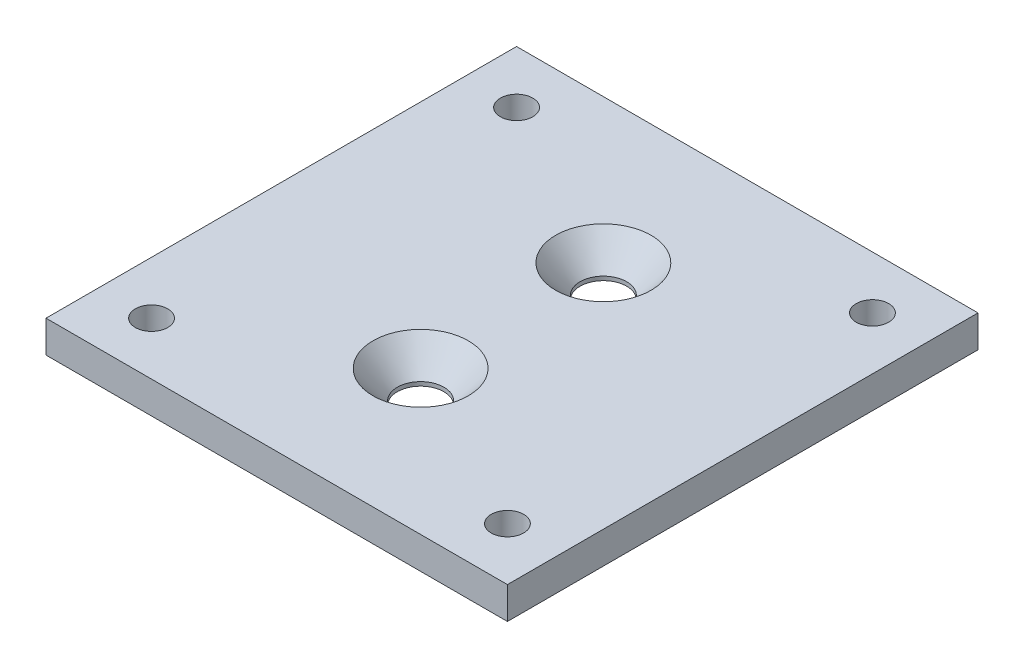
ISO-10303-21;
HEADER;
FILE_DESCRIPTION(('STEP AP214'),'2;1');
FILE_NAME('part.step','',(''),(''),'','','');
FILE_SCHEMA(('AUTOMOTIVE_DESIGN { 1 0 10303 214 1 1 1 1 }'));
ENDSEC;
DATA;
#1=APPLICATION_CONTEXT('core data for automotive mechanical design processes');
#2=APPLICATION_PROTOCOL_DEFINITION('international standard','automotive_design',2000,#1);
#3=PRODUCT_CONTEXT('',#1,'mechanical');
#4=PRODUCT('Part','Part','',(#3));
#5=PRODUCT_RELATED_PRODUCT_CATEGORY('part','',(#4));
#6=PRODUCT_DEFINITION_FORMATION('','',#4);
#7=PRODUCT_DEFINITION_CONTEXT('part definition',#1,'design');
#8=PRODUCT_DEFINITION('design','',#6,#7);
#9=PRODUCT_DEFINITION_SHAPE('','',#8);
#10=(LENGTH_UNIT() NAMED_UNIT(*) SI_UNIT(.MILLI.,.METRE.));
#11=(NAMED_UNIT(*) PLANE_ANGLE_UNIT() SI_UNIT($,.RADIAN.));
#12=(NAMED_UNIT(*) SI_UNIT($,.STERADIAN.) SOLID_ANGLE_UNIT());
#13=UNCERTAINTY_MEASURE_WITH_UNIT(LENGTH_MEASURE(1.E-05),#10,'distance_accuracy_value','');
#14=(GEOMETRIC_REPRESENTATION_CONTEXT(3) GLOBAL_UNCERTAINTY_ASSIGNED_CONTEXT((#13)) GLOBAL_UNIT_ASSIGNED_CONTEXT((#10,
#11,#12)) REPRESENTATION_CONTEXT('',''));
#15=CARTESIAN_POINT('',(0.,0.,0.));
#16=DIRECTION('',(0.,0.,1.));
#17=DIRECTION('',(1.,0.,0.));
#18=AXIS2_PLACEMENT_3D('',#15,#16,#17);
#19=CARTESIAN_POINT('',(0.,3.5,25.75));
#20=DIRECTION('',(0.,0.,-1.));
#21=DIRECTION('',(-1.,0.,0.));
#22=AXIS2_PLACEMENT_3D('',#19,#20,#21);
#23=PLANE('',#22);
#24=DIRECTION('',(1.,0.,0.));
#25=VECTOR('',#24,1.);
#26=CARTESIAN_POINT('',(0.,0.,25.75));
#27=LINE('',#26,#25);
#28=CARTESIAN_POINT('',(-25.25,0.,25.75));
#29=VERTEX_POINT('',#28);
#30=CARTESIAN_POINT('',(25.25,0.,25.75));
#31=VERTEX_POINT('',#30);
#32=EDGE_CURVE('E112',#29,#31,#27,.T.);
#33=ORIENTED_EDGE('',*,*,#32,.T.);
#34=DIRECTION('',(0.,-1.,0.));
#35=VECTOR('',#34,1.);
#36=CARTESIAN_POINT('',(25.25,3.5,25.75));
#37=LINE('',#36,#35);
#38=CARTESIAN_POINT('',(25.25,3.5,25.75));
#39=VERTEX_POINT('',#38);
#40=EDGE_CURVE('E11',#39,#31,#37,.T.);
#41=ORIENTED_EDGE('',*,*,#40,.F.);
#42=DIRECTION('',(1.,0.,0.));
#43=VECTOR('',#42,1.);
#44=CARTESIAN_POINT('',(0.,3.5,25.75));
#45=LINE('',#44,#43);
#46=CARTESIAN_POINT('',(-25.25,3.5,25.75));
#47=VERTEX_POINT('',#46);
#48=EDGE_CURVE('E85',#47,#39,#45,.T.);
#49=ORIENTED_EDGE('',*,*,#48,.F.);
#50=DIRECTION('',(0.,-1.,0.));
#51=VECTOR('',#50,1.);
#52=CARTESIAN_POINT('',(-25.25,3.5,25.75));
#53=LINE('',#52,#51);
#54=EDGE_CURVE('E52',#47,#29,#53,.T.);
#55=ORIENTED_EDGE('',*,*,#54,.T.);
#56=EDGE_LOOP('',(#33,#41,#49,#55));
#57=FACE_BOUND('',#56,.T.);
#58=ADVANCED_FACE('F35',(#57),#23,.F.);
#59=CARTESIAN_POINT('',(25.25,3.5,0.));
#60=DIRECTION('',(-1.,0.,0.));
#61=DIRECTION('',(0.,0.,1.));
#62=AXIS2_PLACEMENT_3D('',#59,#60,#61);
#63=PLANE('',#62);
#64=DIRECTION('',(0.,0.,-1.));
#65=VECTOR('',#64,1.);
#66=CARTESIAN_POINT('',(25.25,0.,0.));
#67=LINE('',#66,#65);
#68=CARTESIAN_POINT('',(25.25,0.,-25.75));
#69=VERTEX_POINT('',#68);
#70=EDGE_CURVE('E90',#31,#69,#67,.T.);
#71=ORIENTED_EDGE('',*,*,#70,.T.);
#72=DIRECTION('',(0.,-1.,0.));
#73=VECTOR('',#72,1.);
#74=CARTESIAN_POINT('',(25.25,3.5,-25.75));
#75=LINE('',#74,#73);
#76=CARTESIAN_POINT('',(25.25,3.5,-25.75));
#77=VERTEX_POINT('',#76);
#78=EDGE_CURVE('E44',#77,#69,#75,.T.);
#79=ORIENTED_EDGE('',*,*,#78,.F.);
#80=DIRECTION('',(0.,0.,-1.));
#81=VECTOR('',#80,1.);
#82=CARTESIAN_POINT('',(25.25,3.5,0.));
#83=LINE('',#82,#81);
#84=EDGE_CURVE('E77',#39,#77,#83,.T.);
#85=ORIENTED_EDGE('',*,*,#84,.F.);
#86=ORIENTED_EDGE('',*,*,#40,.T.);
#87=EDGE_LOOP('',(#71,#79,#85,#86));
#88=FACE_BOUND('',#87,.T.);
#89=ADVANCED_FACE('F89',(#88),#63,.F.);
#90=CARTESIAN_POINT('',(0.,3.5,-25.75));
#91=DIRECTION('',(0.,0.,-1.));
#92=DIRECTION('',(-1.,0.,0.));
#93=AXIS2_PLACEMENT_3D('',#90,#91,#92);
#94=PLANE('',#93);
#95=DIRECTION('',(1.,0.,0.));
#96=VECTOR('',#95,1.);
#97=CARTESIAN_POINT('',(0.,0.,-25.75));
#98=LINE('',#97,#96);
#99=CARTESIAN_POINT('',(-25.25,0.,-25.75));
#100=VERTEX_POINT('',#99);
#101=EDGE_CURVE('E115',#100,#69,#98,.T.);
#102=ORIENTED_EDGE('',*,*,#101,.F.);
#103=DIRECTION('',(0.,-1.,0.));
#104=VECTOR('',#103,1.);
#105=CARTESIAN_POINT('',(-25.25,3.5,-25.75));
#106=LINE('',#105,#104);
#107=CARTESIAN_POINT('',(-25.25,3.5,-25.75));
#108=VERTEX_POINT('',#107);
#109=EDGE_CURVE('E66',#108,#100,#106,.T.);
#110=ORIENTED_EDGE('',*,*,#109,.F.);
#111=DIRECTION('',(1.,0.,0.));
#112=VECTOR('',#111,1.);
#113=CARTESIAN_POINT('',(0.,3.5,-25.75));
#114=LINE('',#113,#112);
#115=EDGE_CURVE('E84',#108,#77,#114,.T.);
#116=ORIENTED_EDGE('',*,*,#115,.T.);
#117=ORIENTED_EDGE('',*,*,#78,.T.);
#118=EDGE_LOOP('',(#102,#110,#116,#117));
#119=FACE_BOUND('',#118,.T.);
#120=ADVANCED_FACE('F93',(#119),#94,.T.);
#121=CARTESIAN_POINT('',(19.475,3.5,19.975));
#122=DIRECTION('',(0.,-1.,0.));
#123=DIRECTION('',(0.,0.,-1.));
#124=AXIS2_PLACEMENT_3D('',#121,#122,#123);
#125=CYLINDRICAL_SURFACE('',#124,1.775);
#126=CARTESIAN_POINT('',(19.475,3.5,19.975));
#127=DIRECTION('',(0.,1.,0.));
#128=DIRECTION('',(0.,0.,1.));
#129=AXIS2_PLACEMENT_3D('',#126,#127,#128);
#130=CIRCLE('',#129,1.775);
#131=CARTESIAN_POINT('',(19.475,3.5,21.75));
#132=VERTEX_POINT('',#131);
#133=EDGE_CURVE('E136',#132,#132,#130,.T.);
#134=ORIENTED_EDGE('',*,*,#133,.T.);
#135=EDGE_LOOP('',(#134));
#136=FACE_BOUND('',#135,.T.);
#137=CARTESIAN_POINT('',(19.475,0.,19.975));
#138=DIRECTION('',(0.,1.,0.));
#139=DIRECTION('',(0.,0.,1.));
#140=AXIS2_PLACEMENT_3D('',#137,#138,#139);
#141=CIRCLE('',#140,1.775);
#142=CARTESIAN_POINT('',(19.475,0.,21.75));
#143=VERTEX_POINT('',#142);
#144=EDGE_CURVE('E109',#143,#143,#141,.T.);
#145=ORIENTED_EDGE('',*,*,#144,.F.);
#146=EDGE_LOOP('',(#145));
#147=FACE_BOUND('',#146,.T.);
#148=ADVANCED_FACE('F140',(#136,#147),#125,.F.);
#149=CARTESIAN_POINT('',(-19.475,3.5,19.975));
#150=DIRECTION('',(0.,-1.,0.));
#151=DIRECTION('',(0.,0.,-1.));
#152=AXIS2_PLACEMENT_3D('',#149,#150,#151);
#153=CYLINDRICAL_SURFACE('',#152,1.775);
#154=CARTESIAN_POINT('',(-19.475,3.5,19.975));
#155=DIRECTION('',(0.,1.,0.));
#156=DIRECTION('',(0.,0.,1.));
#157=AXIS2_PLACEMENT_3D('',#154,#155,#156);
#158=CIRCLE('',#157,1.775);
#159=CARTESIAN_POINT('',(-19.475,3.5,21.75));
#160=VERTEX_POINT('',#159);
#161=EDGE_CURVE('E129',#160,#160,#158,.T.);
#162=ORIENTED_EDGE('',*,*,#161,.T.);
#163=EDGE_LOOP('',(#162));
#164=FACE_BOUND('',#163,.T.);
#165=CARTESIAN_POINT('',(-19.475,0.,19.975));
#166=DIRECTION('',(0.,1.,0.));
#167=DIRECTION('',(0.,0.,1.));
#168=AXIS2_PLACEMENT_3D('',#165,#166,#167);
#169=CIRCLE('',#168,1.775);
#170=CARTESIAN_POINT('',(-19.475,0.,21.75));
#171=VERTEX_POINT('',#170);
#172=EDGE_CURVE('E106',#171,#171,#169,.T.);
#173=ORIENTED_EDGE('',*,*,#172,.F.);
#174=EDGE_LOOP('',(#173));
#175=FACE_BOUND('',#174,.T.);
#176=ADVANCED_FACE('F169',(#164,#175),#153,.F.);
#177=CARTESIAN_POINT('',(19.475,3.5,-19.975));
#178=DIRECTION('',(0.,-1.,0.));
#179=DIRECTION('',(0.,0.,-1.));
#180=AXIS2_PLACEMENT_3D('',#177,#178,#179);
#181=CYLINDRICAL_SURFACE('',#180,1.775);
#182=CARTESIAN_POINT('',(19.475,3.5,-19.975));
#183=DIRECTION('',(0.,1.,0.));
#184=DIRECTION('',(0.,0.,1.));
#185=AXIS2_PLACEMENT_3D('',#182,#183,#184);
#186=CIRCLE('',#185,1.775);
#187=CARTESIAN_POINT('',(19.475,3.5,-18.2));
#188=VERTEX_POINT('',#187);
#189=EDGE_CURVE('E124',#188,#188,#186,.T.);
#190=ORIENTED_EDGE('',*,*,#189,.T.);
#191=EDGE_LOOP('',(#190));
#192=FACE_BOUND('',#191,.T.);
#193=CARTESIAN_POINT('',(19.475,0.,-19.975));
#194=DIRECTION('',(0.,1.,0.));
#195=DIRECTION('',(0.,0.,1.));
#196=AXIS2_PLACEMENT_3D('',#193,#194,#195);
#197=CIRCLE('',#196,1.775);
#198=CARTESIAN_POINT('',(19.475,0.,-18.2));
#199=VERTEX_POINT('',#198);
#200=EDGE_CURVE('E102',#199,#199,#197,.T.);
#201=ORIENTED_EDGE('',*,*,#200,.F.);
#202=EDGE_LOOP('',(#201));
#203=FACE_BOUND('',#202,.T.);
#204=ADVANCED_FACE('F171',(#192,#203),#181,.F.);
#205=CARTESIAN_POINT('',(-19.475,3.5,-19.975));
#206=DIRECTION('',(0.,-1.,0.));
#207=DIRECTION('',(0.,0.,-1.));
#208=AXIS2_PLACEMENT_3D('',#205,#206,#207);
#209=CYLINDRICAL_SURFACE('',#208,1.775);
#210=CARTESIAN_POINT('',(-19.475,3.5,-19.975));
#211=DIRECTION('',(0.,1.,0.));
#212=DIRECTION('',(0.,0.,1.));
#213=AXIS2_PLACEMENT_3D('',#210,#211,#212);
#214=CIRCLE('',#213,1.775);
#215=CARTESIAN_POINT('',(-19.475,3.5,-18.2));
#216=VERTEX_POINT('',#215);
#217=EDGE_CURVE('E120',#216,#216,#214,.T.);
#218=ORIENTED_EDGE('',*,*,#217,.T.);
#219=EDGE_LOOP('',(#218));
#220=FACE_BOUND('',#219,.T.);
#221=CARTESIAN_POINT('',(-19.475,0.,-19.975));
#222=DIRECTION('',(0.,1.,0.));
#223=DIRECTION('',(0.,0.,1.));
#224=AXIS2_PLACEMENT_3D('',#221,#222,#223);
#225=CIRCLE('',#224,1.775);
#226=CARTESIAN_POINT('',(-19.475,0.,-18.2));
#227=VERTEX_POINT('',#226);
#228=EDGE_CURVE('E99',#227,#227,#225,.T.);
#229=ORIENTED_EDGE('',*,*,#228,.F.);
#230=EDGE_LOOP('',(#229));
#231=FACE_BOUND('',#230,.T.);
#232=ADVANCED_FACE('F37',(#220,#231),#209,.F.);
#233=CARTESIAN_POINT('',(-25.25,3.5,0.));
#234=DIRECTION('',(-1.,0.,0.));
#235=DIRECTION('',(0.,0.,1.));
#236=AXIS2_PLACEMENT_3D('',#233,#234,#235);
#237=PLANE('',#236);
#238=DIRECTION('',(0.,0.,-1.));
#239=VECTOR('',#238,1.);
#240=CARTESIAN_POINT('',(-25.25,0.,0.));
#241=LINE('',#240,#239);
#242=EDGE_CURVE('E117',#29,#100,#241,.T.);
#243=ORIENTED_EDGE('',*,*,#242,.F.);
#244=ORIENTED_EDGE('',*,*,#54,.F.);
#245=DIRECTION('',(0.,0.,-1.));
#246=VECTOR('',#245,1.);
#247=CARTESIAN_POINT('',(-25.25,3.5,0.));
#248=LINE('',#247,#246);
#249=EDGE_CURVE('E94',#47,#108,#248,.T.);
#250=ORIENTED_EDGE('',*,*,#249,.T.);
#251=ORIENTED_EDGE('',*,*,#109,.T.);
#252=EDGE_LOOP('',(#243,#244,#250,#251));
#253=FACE_BOUND('',#252,.T.);
#254=ADVANCED_FACE('F145',(#253),#237,.T.);
#255=CARTESIAN_POINT('',(0.,3.5,0.));
#256=DIRECTION('',(0.,1.,0.));
#257=DIRECTION('',(0.,0.,1.));
#258=AXIS2_PLACEMENT_3D('',#255,#256,#257);
#259=PLANE('',#258);
#260=CARTESIAN_POINT('',(0.,3.5,-10.));
#261=DIRECTION('',(0.,1.,0.));
#262=DIRECTION('',(0.,0.,1.));
#263=AXIS2_PLACEMENT_3D('',#260,#261,#262);
#264=CIRCLE('',#263,5.2197);
#265=CARTESIAN_POINT('',(0.,3.5,-4.7803));
#266=VERTEX_POINT('',#265);
#267=EDGE_CURVE('E258',#266,#266,#264,.T.);
#268=ORIENTED_EDGE('',*,*,#267,.F.);
#269=EDGE_LOOP('',(#268));
#270=FACE_BOUND('',#269,.T.);
#271=CARTESIAN_POINT('',(0.,3.5,10.));
#272=DIRECTION('',(0.,1.,0.));
#273=DIRECTION('',(0.,0.,1.));
#274=AXIS2_PLACEMENT_3D('',#271,#272,#273);
#275=CIRCLE('',#274,5.2197);
#276=CARTESIAN_POINT('',(0.,3.5,15.2197));
#277=VERTEX_POINT('',#276);
#278=EDGE_CURVE('E265',#277,#277,#275,.T.);
#279=ORIENTED_EDGE('',*,*,#278,.F.);
#280=EDGE_LOOP('',(#279));
#281=FACE_BOUND('',#280,.T.);
#282=ORIENTED_EDGE('',*,*,#217,.F.);
#283=EDGE_LOOP('',(#282));
#284=FACE_BOUND('',#283,.T.);
#285=ORIENTED_EDGE('',*,*,#189,.F.);
#286=EDGE_LOOP('',(#285));
#287=FACE_BOUND('',#286,.T.);
#288=ORIENTED_EDGE('',*,*,#161,.F.);
#289=EDGE_LOOP('',(#288));
#290=FACE_BOUND('',#289,.T.);
#291=ORIENTED_EDGE('',*,*,#133,.F.);
#292=EDGE_LOOP('',(#291));
#293=FACE_BOUND('',#292,.T.);
#294=ORIENTED_EDGE('',*,*,#48,.T.);
#295=ORIENTED_EDGE('',*,*,#84,.T.);
#296=ORIENTED_EDGE('',*,*,#115,.F.);
#297=ORIENTED_EDGE('',*,*,#249,.F.);
#298=EDGE_LOOP('',(#294,#295,#296,#297));
#299=FACE_BOUND('',#298,.T.);
#300=ADVANCED_FACE('F81',(#270,#281,#284,#287,#290,#293,#299),#259,.T.);
#301=CARTESIAN_POINT('',(0.,0.,0.));
#302=DIRECTION('',(0.,1.,0.));
#303=DIRECTION('',(0.,0.,1.));
#304=AXIS2_PLACEMENT_3D('',#301,#302,#303);
#305=PLANE('',#304);
#306=CARTESIAN_POINT('',(0.,0.,-10.));
#307=DIRECTION('',(0.,1.,0.));
#308=DIRECTION('',(0.,0.,1.));
#309=AXIS2_PLACEMENT_3D('',#306,#307,#308);
#310=CIRCLE('',#309,2.5527);
#311=CARTESIAN_POINT('',(0.,0.,-7.4473));
#312=VERTEX_POINT('',#311);
#313=EDGE_CURVE('E260',#312,#312,#310,.T.);
#314=ORIENTED_EDGE('',*,*,#313,.T.);
#315=EDGE_LOOP('',(#314));
#316=FACE_BOUND('',#315,.T.);
#317=CARTESIAN_POINT('',(0.,0.,10.));
#318=DIRECTION('',(0.,1.,0.));
#319=DIRECTION('',(0.,0.,1.));
#320=AXIS2_PLACEMENT_3D('',#317,#318,#319);
#321=CIRCLE('',#320,2.5527);
#322=CARTESIAN_POINT('',(0.,0.,12.5527));
#323=VERTEX_POINT('',#322);
#324=EDGE_CURVE('E103',#323,#323,#321,.T.);
#325=ORIENTED_EDGE('',*,*,#324,.T.);
#326=EDGE_LOOP('',(#325));
#327=FACE_BOUND('',#326,.T.);
#328=ORIENTED_EDGE('',*,*,#228,.T.);
#329=EDGE_LOOP('',(#328));
#330=FACE_BOUND('',#329,.T.);
#331=ORIENTED_EDGE('',*,*,#200,.T.);
#332=EDGE_LOOP('',(#331));
#333=FACE_BOUND('',#332,.T.);
#334=ORIENTED_EDGE('',*,*,#172,.T.);
#335=EDGE_LOOP('',(#334));
#336=FACE_BOUND('',#335,.T.);
#337=ORIENTED_EDGE('',*,*,#144,.T.);
#338=EDGE_LOOP('',(#337));
#339=FACE_BOUND('',#338,.T.);
#340=ORIENTED_EDGE('',*,*,#32,.F.);
#341=ORIENTED_EDGE('',*,*,#242,.T.);
#342=ORIENTED_EDGE('',*,*,#101,.T.);
#343=ORIENTED_EDGE('',*,*,#70,.F.);
#344=EDGE_LOOP('',(#340,#341,#342,#343));
#345=FACE_BOUND('',#344,.T.);
#346=ADVANCED_FACE('F144',(#316,#327,#330,#333,#336,#339,#345),#305,.F.);
#347=CARTESIAN_POINT('',(0.,3.5,10.));
#348=DIRECTION('',(0.,1.,0.));
#349=DIRECTION('',(0.,0.,1.));
#350=AXIS2_PLACEMENT_3D('',#347,#348,#349);
#351=CYLINDRICAL_SURFACE('',#350,2.5527);
#352=ORIENTED_EDGE('',*,*,#324,.F.);
#353=EDGE_LOOP('',(#352));
#354=FACE_BOUND('',#353,.T.);
#355=CARTESIAN_POINT('',(0.,0.431967457941568,10.));
#356=DIRECTION('',(0.,1.,0.));
#357=DIRECTION('',(0.,0.,1.));
#358=AXIS2_PLACEMENT_3D('',#355,#356,#357);
#359=CIRCLE('',#358,2.5527);
#360=CARTESIAN_POINT('',(0.,0.431967457941568,12.5527));
#361=VERTEX_POINT('',#360);
#362=EDGE_CURVE('E267',#361,#361,#359,.T.);
#363=ORIENTED_EDGE('',*,*,#362,.T.);
#364=EDGE_LOOP('',(#363));
#365=FACE_BOUND('',#364,.T.);
#366=ADVANCED_FACE('F152',(#354,#365),#351,.F.);
#367=CARTESIAN_POINT('',(0.,3.5,10.));
#368=DIRECTION('',(0.,1.,0.));
#369=DIRECTION('',(0.,0.,1.));
#370=AXIS2_PLACEMENT_3D('',#367,#368,#369);
#371=CONICAL_SURFACE('',#370,5.2197,0.715584993317675);
#372=ORIENTED_EDGE('',*,*,#362,.F.);
#373=EDGE_LOOP('',(#372));
#374=FACE_BOUND('',#373,.T.);
#375=ORIENTED_EDGE('',*,*,#278,.T.);
#376=EDGE_LOOP('',(#375));
#377=FACE_BOUND('',#376,.T.);
#378=ADVANCED_FACE('F220',(#374,#377),#371,.F.);
#379=CARTESIAN_POINT('',(0.,3.5,-10.));
#380=DIRECTION('',(0.,1.,0.));
#381=DIRECTION('',(0.,0.,1.));
#382=AXIS2_PLACEMENT_3D('',#379,#380,#381);
#383=CYLINDRICAL_SURFACE('',#382,2.5527);
#384=ORIENTED_EDGE('',*,*,#313,.F.);
#385=EDGE_LOOP('',(#384));
#386=FACE_BOUND('',#385,.T.);
#387=CARTESIAN_POINT('',(0.,0.431967457941568,-10.));
#388=DIRECTION('',(0.,1.,0.));
#389=DIRECTION('',(0.,0.,1.));
#390=AXIS2_PLACEMENT_3D('',#387,#388,#389);
#391=CIRCLE('',#390,2.5527);
#392=CARTESIAN_POINT('',(0.,0.431967457941568,-7.4473));
#393=VERTEX_POINT('',#392);
#394=EDGE_CURVE('E256',#393,#393,#391,.T.);
#395=ORIENTED_EDGE('',*,*,#394,.T.);
#396=EDGE_LOOP('',(#395));
#397=FACE_BOUND('',#396,.T.);
#398=ADVANCED_FACE('F229',(#386,#397),#383,.F.);
#399=CARTESIAN_POINT('',(0.,3.5,-10.));
#400=DIRECTION('',(0.,1.,0.));
#401=DIRECTION('',(0.,0.,1.));
#402=AXIS2_PLACEMENT_3D('',#399,#400,#401);
#403=CONICAL_SURFACE('',#402,5.2197,0.715584993317675);
#404=ORIENTED_EDGE('',*,*,#394,.F.);
#405=EDGE_LOOP('',(#404));
#406=FACE_BOUND('',#405,.T.);
#407=ORIENTED_EDGE('',*,*,#267,.T.);
#408=EDGE_LOOP('',(#407));
#409=FACE_BOUND('',#408,.T.);
#410=ADVANCED_FACE('F239',(#406,#409),#403,.F.);
#411=CLOSED_SHELL('',(#58,#89,#120,#148,#176,#204,#232,#254,#300,#346,#366,#378,#398,#410));
#412=MANIFOLD_SOLID_BREP('B2',#411);
#413=ADVANCED_BREP_SHAPE_REPRESENTATION('',(#18,#412),#14);
#414=SHAPE_DEFINITION_REPRESENTATION(#9,#413);
ENDSEC;
END-ISO-10303-21;
